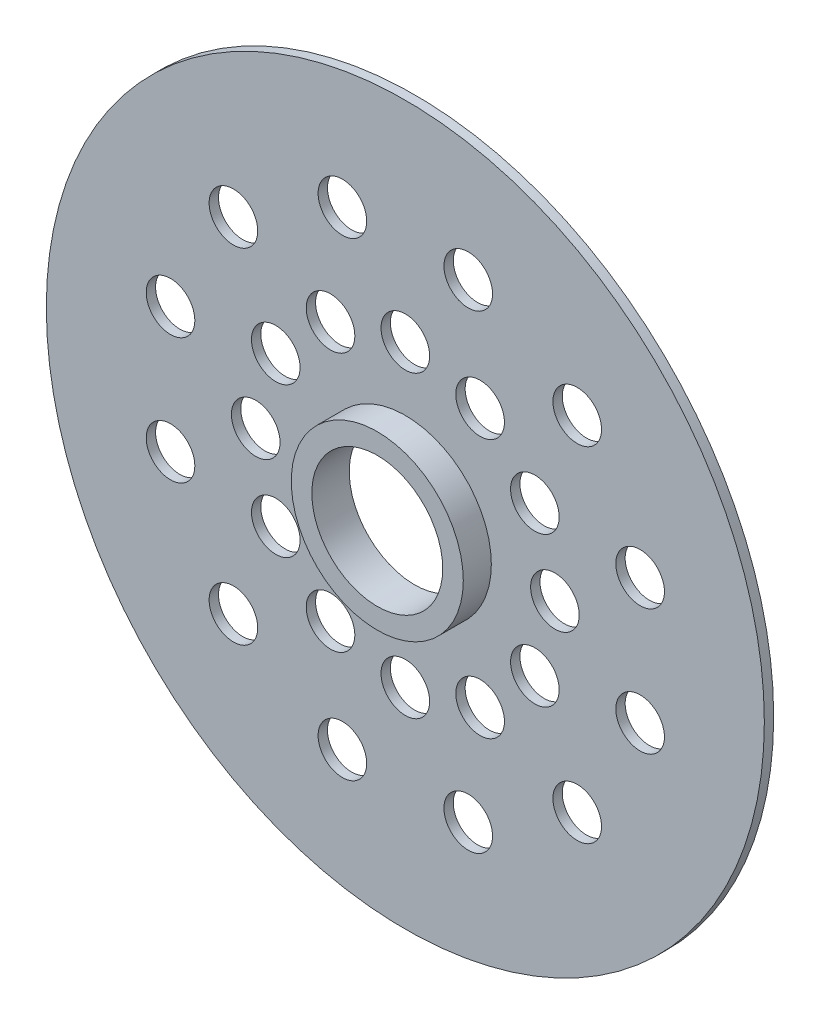
ISO-10303-21;
HEADER;
FILE_DESCRIPTION(('STEP AP214'),'2;1');
FILE_NAME('part.step','',(''),(''),'','','');
FILE_SCHEMA(('AUTOMOTIVE_DESIGN { 1 0 10303 214 1 1 1 1 }'));
ENDSEC;
DATA;
#1=APPLICATION_CONTEXT('core data for automotive mechanical design processes');
#2=APPLICATION_PROTOCOL_DEFINITION('international standard','automotive_design',2000,#1);
#3=PRODUCT_CONTEXT('',#1,'mechanical');
#4=PRODUCT('Part','Part','',(#3));
#5=PRODUCT_RELATED_PRODUCT_CATEGORY('part','',(#4));
#6=PRODUCT_DEFINITION_FORMATION('','',#4);
#7=PRODUCT_DEFINITION_CONTEXT('part definition',#1,'design');
#8=PRODUCT_DEFINITION('design','',#6,#7);
#9=PRODUCT_DEFINITION_SHAPE('','',#8);
#10=(LENGTH_UNIT() NAMED_UNIT(*) SI_UNIT(.MILLI.,.METRE.));
#11=(NAMED_UNIT(*) PLANE_ANGLE_UNIT() SI_UNIT($,.RADIAN.));
#12=(NAMED_UNIT(*) SI_UNIT($,.STERADIAN.) SOLID_ANGLE_UNIT());
#13=UNCERTAINTY_MEASURE_WITH_UNIT(LENGTH_MEASURE(1.E-05),#10,'distance_accuracy_value','');
#14=(GEOMETRIC_REPRESENTATION_CONTEXT(3) GLOBAL_UNCERTAINTY_ASSIGNED_CONTEXT((#13)) GLOBAL_UNIT_ASSIGNED_CONTEXT((#10,
#11,#12)) REPRESENTATION_CONTEXT('',''));
#15=CARTESIAN_POINT('',(0.,0.,0.));
#16=DIRECTION('',(0.,0.,1.));
#17=DIRECTION('',(1.,0.,0.));
#18=AXIS2_PLACEMENT_3D('',#15,#16,#17);
#19=CARTESIAN_POINT('',(0.,0.,-44.5));
#20=DIRECTION('',(0.,0.,1.));
#21=DIRECTION('',(1.,0.,0.));
#22=AXIS2_PLACEMENT_3D('',#19,#20,#21);
#23=PLANE('',#22);
#24=CARTESIAN_POINT('',(-45.9619407771256,45.9619407771256,-44.5));
#25=DIRECTION('',(0.,0.,1.));
#26=DIRECTION('',(1.,0.,0.));
#27=AXIS2_PLACEMENT_3D('',#24,#25,#26);
#28=CIRCLE('',#27,6.5);
#29=CARTESIAN_POINT('',(-39.4619407771256,45.9619407771256,-44.5));
#30=VERTEX_POINT('',#29);
#31=EDGE_CURVE('E184',#30,#30,#28,.T.);
#32=ORIENTED_EDGE('',*,*,#31,.F.);
#33=EDGE_LOOP('',(#32));
#34=FACE_BOUND('',#33,.T.);
#35=CARTESIAN_POINT('',(-16.8232379316639,62.7851787087894,-44.5));
#36=DIRECTION('',(0.,0.,1.));
#37=DIRECTION('',(1.,0.,0.));
#38=AXIS2_PLACEMENT_3D('',#35,#36,#37);
#39=CIRCLE('',#38,6.5);
#40=CARTESIAN_POINT('',(-10.3232379316639,62.7851787087894,-44.5));
#41=VERTEX_POINT('',#40);
#42=EDGE_CURVE('E168',#41,#41,#39,.T.);
#43=ORIENTED_EDGE('',*,*,#42,.F.);
#44=EDGE_LOOP('',(#43));
#45=FACE_BOUND('',#44,.T.);
#46=CARTESIAN_POINT('',(16.8232379316638,62.7851787087894,-44.5));
#47=DIRECTION('',(0.,0.,1.));
#48=DIRECTION('',(1.,0.,0.));
#49=AXIS2_PLACEMENT_3D('',#46,#47,#48);
#50=CIRCLE('',#49,6.5);
#51=CARTESIAN_POINT('',(23.3232379316638,62.7851787087894,-44.5));
#52=VERTEX_POINT('',#51);
#53=EDGE_CURVE('E164',#52,#52,#50,.T.);
#54=ORIENTED_EDGE('',*,*,#53,.F.);
#55=EDGE_LOOP('',(#54));
#56=FACE_BOUND('',#55,.T.);
#57=CARTESIAN_POINT('',(45.9619407771256,45.9619407771256,-44.5));
#58=DIRECTION('',(0.,0.,1.));
#59=DIRECTION('',(1.,0.,0.));
#60=AXIS2_PLACEMENT_3D('',#57,#58,#59);
#61=CIRCLE('',#60,6.5);
#62=CARTESIAN_POINT('',(52.4619407771256,45.9619407771256,-44.5));
#63=VERTEX_POINT('',#62);
#64=EDGE_CURVE('E160',#63,#63,#61,.T.);
#65=ORIENTED_EDGE('',*,*,#64,.F.);
#66=EDGE_LOOP('',(#65));
#67=FACE_BOUND('',#66,.T.);
#68=CARTESIAN_POINT('',(62.7851787087894,16.8232379316638,-44.5));
#69=DIRECTION('',(0.,0.,1.));
#70=DIRECTION('',(1.,0.,0.));
#71=AXIS2_PLACEMENT_3D('',#68,#69,#70);
#72=CIRCLE('',#71,6.50000000000001);
#73=CARTESIAN_POINT('',(69.2851787087894,16.8232379316638,-44.5));
#74=VERTEX_POINT('',#73);
#75=EDGE_CURVE('E155',#74,#74,#72,.T.);
#76=ORIENTED_EDGE('',*,*,#75,.F.);
#77=EDGE_LOOP('',(#76));
#78=FACE_BOUND('',#77,.T.);
#79=CARTESIAN_POINT('',(34.6410161513775,-20.,-44.5));
#80=DIRECTION('',(0.,0.,1.));
#81=DIRECTION('',(1.,0.,0.));
#82=AXIS2_PLACEMENT_3D('',#79,#80,#81);
#83=CIRCLE('',#82,6.5);
#84=CARTESIAN_POINT('',(41.1410161513775,-20.,-44.5));
#85=VERTEX_POINT('',#84);
#86=EDGE_CURVE('E150',#85,#85,#83,.T.);
#87=ORIENTED_EDGE('',*,*,#86,.F.);
#88=EDGE_LOOP('',(#87));
#89=FACE_BOUND('',#88,.T.);
#90=CARTESIAN_POINT('',(20.,-34.6410161513775,-44.5));
#91=DIRECTION('',(0.,0.,1.));
#92=DIRECTION('',(1.,0.,0.));
#93=AXIS2_PLACEMENT_3D('',#90,#91,#92);
#94=CIRCLE('',#93,6.5);
#95=CARTESIAN_POINT('',(26.5,-34.6410161513775,-44.5));
#96=VERTEX_POINT('',#95);
#97=EDGE_CURVE('E145',#96,#96,#94,.T.);
#98=ORIENTED_EDGE('',*,*,#97,.F.);
#99=EDGE_LOOP('',(#98));
#100=FACE_BOUND('',#99,.T.);
#101=CARTESIAN_POINT('',(0.,-40.,-44.5));
#102=DIRECTION('',(0.,0.,1.));
#103=DIRECTION('',(1.,0.,0.));
#104=AXIS2_PLACEMENT_3D('',#101,#102,#103);
#105=CIRCLE('',#104,6.5);
#106=CARTESIAN_POINT('',(6.49999999999999,-40.,-44.5));
#107=VERTEX_POINT('',#106);
#108=EDGE_CURVE('E140',#107,#107,#105,.T.);
#109=ORIENTED_EDGE('',*,*,#108,.F.);
#110=EDGE_LOOP('',(#109));
#111=FACE_BOUND('',#110,.T.);
#112=CARTESIAN_POINT('',(34.6410161513775,20.,-44.5));
#113=DIRECTION('',(0.,0.,1.));
#114=DIRECTION('',(1.,0.,0.));
#115=AXIS2_PLACEMENT_3D('',#112,#113,#114);
#116=CIRCLE('',#115,6.5);
#117=CARTESIAN_POINT('',(41.1410161513775,20.,-44.5));
#118=VERTEX_POINT('',#117);
#119=EDGE_CURVE('E135',#118,#118,#116,.T.);
#120=ORIENTED_EDGE('',*,*,#119,.F.);
#121=EDGE_LOOP('',(#120));
#122=FACE_BOUND('',#121,.T.);
#123=CARTESIAN_POINT('',(20.,34.6410161513775,-44.5));
#124=DIRECTION('',(0.,0.,1.));
#125=DIRECTION('',(1.,0.,0.));
#126=AXIS2_PLACEMENT_3D('',#123,#124,#125);
#127=CIRCLE('',#126,6.5);
#128=CARTESIAN_POINT('',(26.5,34.6410161513775,-44.5));
#129=VERTEX_POINT('',#128);
#130=EDGE_CURVE('E130',#129,#129,#127,.T.);
#131=ORIENTED_EDGE('',*,*,#130,.F.);
#132=EDGE_LOOP('',(#131));
#133=FACE_BOUND('',#132,.T.);
#134=CARTESIAN_POINT('',(0.,40.,-44.5));
#135=DIRECTION('',(0.,0.,1.));
#136=DIRECTION('',(1.,0.,0.));
#137=AXIS2_PLACEMENT_3D('',#134,#135,#136);
#138=CIRCLE('',#137,6.5);
#139=CARTESIAN_POINT('',(6.5,40.,-44.5));
#140=VERTEX_POINT('',#139);
#141=EDGE_CURVE('E125',#140,#140,#138,.T.);
#142=ORIENTED_EDGE('',*,*,#141,.F.);
#143=EDGE_LOOP('',(#142));
#144=FACE_BOUND('',#143,.T.);
#145=CARTESIAN_POINT('',(-20.,34.6410161513775,-44.5));
#146=DIRECTION('',(0.,0.,1.));
#147=DIRECTION('',(1.,0.,0.));
#148=AXIS2_PLACEMENT_3D('',#145,#146,#147);
#149=CIRCLE('',#148,6.5);
#150=CARTESIAN_POINT('',(-13.5,34.6410161513775,-44.5));
#151=VERTEX_POINT('',#150);
#152=EDGE_CURVE('E120',#151,#151,#149,.T.);
#153=ORIENTED_EDGE('',*,*,#152,.F.);
#154=EDGE_LOOP('',(#153));
#155=FACE_BOUND('',#154,.T.);
#156=CARTESIAN_POINT('',(-34.6410161513775,20.,-44.5));
#157=DIRECTION('',(0.,0.,1.));
#158=DIRECTION('',(1.,0.,0.));
#159=AXIS2_PLACEMENT_3D('',#156,#157,#158);
#160=CIRCLE('',#159,6.5);
#161=CARTESIAN_POINT('',(-28.1410161513775,20.,-44.5));
#162=VERTEX_POINT('',#161);
#163=EDGE_CURVE('E115',#162,#162,#160,.T.);
#164=ORIENTED_EDGE('',*,*,#163,.F.);
#165=EDGE_LOOP('',(#164));
#166=FACE_BOUND('',#165,.T.);
#167=CARTESIAN_POINT('',(-40.,0.,-44.5));
#168=DIRECTION('',(0.,0.,1.));
#169=DIRECTION('',(1.,0.,0.));
#170=AXIS2_PLACEMENT_3D('',#167,#168,#169);
#171=CIRCLE('',#170,6.5);
#172=CARTESIAN_POINT('',(-33.5,0.,-44.5));
#173=VERTEX_POINT('',#172);
#174=EDGE_CURVE('E110',#173,#173,#171,.T.);
#175=ORIENTED_EDGE('',*,*,#174,.F.);
#176=EDGE_LOOP('',(#175));
#177=FACE_BOUND('',#176,.T.);
#178=CARTESIAN_POINT('',(-34.6410161513775,-20.,-44.5));
#179=DIRECTION('',(0.,0.,1.));
#180=DIRECTION('',(1.,0.,0.));
#181=AXIS2_PLACEMENT_3D('',#178,#179,#180);
#182=CIRCLE('',#181,6.5);
#183=CARTESIAN_POINT('',(-28.1410161513775,-20.,-44.5));
#184=VERTEX_POINT('',#183);
#185=EDGE_CURVE('E105',#184,#184,#182,.T.);
#186=ORIENTED_EDGE('',*,*,#185,.F.);
#187=EDGE_LOOP('',(#186));
#188=FACE_BOUND('',#187,.T.);
#189=CARTESIAN_POINT('',(-20.,-34.6410161513775,-44.5));
#190=DIRECTION('',(0.,0.,1.));
#191=DIRECTION('',(1.,0.,0.));
#192=AXIS2_PLACEMENT_3D('',#189,#190,#191);
#193=CIRCLE('',#192,6.5);
#194=CARTESIAN_POINT('',(-13.5,-34.6410161513775,-44.5));
#195=VERTEX_POINT('',#194);
#196=EDGE_CURVE('E101',#195,#195,#193,.T.);
#197=ORIENTED_EDGE('',*,*,#196,.F.);
#198=EDGE_LOOP('',(#197));
#199=FACE_BOUND('',#198,.T.);
#200=CARTESIAN_POINT('',(-62.7851787087894,16.8232379316639,-44.5));
#201=DIRECTION('',(0.,0.,1.));
#202=DIRECTION('',(1.,0.,0.));
#203=AXIS2_PLACEMENT_3D('',#200,#201,#202);
#204=CIRCLE('',#203,6.5);
#205=CARTESIAN_POINT('',(-56.2851787087894,16.8232379316639,-44.5));
#206=VERTEX_POINT('',#205);
#207=EDGE_CURVE('E96',#206,#206,#204,.T.);
#208=ORIENTED_EDGE('',*,*,#207,.F.);
#209=EDGE_LOOP('',(#208));
#210=FACE_BOUND('',#209,.T.);
#211=CARTESIAN_POINT('',(-62.7851787087894,-16.8232379316638,-44.5));
#212=DIRECTION('',(0.,0.,1.));
#213=DIRECTION('',(1.,0.,0.));
#214=AXIS2_PLACEMENT_3D('',#211,#212,#213);
#215=CIRCLE('',#214,6.5);
#216=CARTESIAN_POINT('',(-56.2851787087894,-16.8232379316638,-44.5));
#217=VERTEX_POINT('',#216);
#218=EDGE_CURVE('E91',#217,#217,#215,.T.);
#219=ORIENTED_EDGE('',*,*,#218,.F.);
#220=EDGE_LOOP('',(#219));
#221=FACE_BOUND('',#220,.T.);
#222=CARTESIAN_POINT('',(-45.9619407771256,-45.9619407771256,-44.5));
#223=DIRECTION('',(0.,0.,1.));
#224=DIRECTION('',(1.,0.,0.));
#225=AXIS2_PLACEMENT_3D('',#222,#223,#224);
#226=CIRCLE('',#225,6.5);
#227=CARTESIAN_POINT('',(-39.4619407771256,-45.9619407771256,-44.5));
#228=VERTEX_POINT('',#227);
#229=EDGE_CURVE('E86',#228,#228,#226,.T.);
#230=ORIENTED_EDGE('',*,*,#229,.F.);
#231=EDGE_LOOP('',(#230));
#232=FACE_BOUND('',#231,.T.);
#233=CARTESIAN_POINT('',(-16.8232379316638,-62.7851787087894,-44.5));
#234=DIRECTION('',(0.,0.,1.));
#235=DIRECTION('',(1.,0.,0.));
#236=AXIS2_PLACEMENT_3D('',#233,#234,#235);
#237=CIRCLE('',#236,6.5);
#238=CARTESIAN_POINT('',(-10.3232379316638,-62.7851787087894,-44.5));
#239=VERTEX_POINT('',#238);
#240=EDGE_CURVE('E81',#239,#239,#237,.T.);
#241=ORIENTED_EDGE('',*,*,#240,.F.);
#242=EDGE_LOOP('',(#241));
#243=FACE_BOUND('',#242,.T.);
#244=CARTESIAN_POINT('',(16.8232379316639,-62.7851787087894,-44.5));
#245=DIRECTION('',(0.,0.,1.));
#246=DIRECTION('',(1.,0.,0.));
#247=AXIS2_PLACEMENT_3D('',#244,#245,#246);
#248=CIRCLE('',#247,6.5);
#249=CARTESIAN_POINT('',(23.3232379316639,-62.7851787087894,-44.5));
#250=VERTEX_POINT('',#249);
#251=EDGE_CURVE('E76',#250,#250,#248,.T.);
#252=ORIENTED_EDGE('',*,*,#251,.F.);
#253=EDGE_LOOP('',(#252));
#254=FACE_BOUND('',#253,.T.);
#255=CARTESIAN_POINT('',(45.9619407771256,-45.9619407771256,-44.5));
#256=DIRECTION('',(0.,0.,1.));
#257=DIRECTION('',(1.,0.,0.));
#258=AXIS2_PLACEMENT_3D('',#255,#256,#257);
#259=CIRCLE('',#258,6.5);
#260=CARTESIAN_POINT('',(52.4619407771256,-45.9619407771256,-44.5));
#261=VERTEX_POINT('',#260);
#262=EDGE_CURVE('E72',#261,#261,#259,.T.);
#263=ORIENTED_EDGE('',*,*,#262,.F.);
#264=EDGE_LOOP('',(#263));
#265=FACE_BOUND('',#264,.T.);
#266=CARTESIAN_POINT('',(62.7851787087894,-16.8232379316638,-44.5));
#267=DIRECTION('',(0.,0.,1.));
#268=DIRECTION('',(1.,0.,0.));
#269=AXIS2_PLACEMENT_3D('',#266,#267,#268);
#270=CIRCLE('',#269,6.50000000000001);
#271=CARTESIAN_POINT('',(69.2851787087894,-16.8232379316638,-44.5));
#272=VERTEX_POINT('',#271);
#273=EDGE_CURVE('E67',#272,#272,#270,.T.);
#274=ORIENTED_EDGE('',*,*,#273,.F.);
#275=EDGE_LOOP('',(#274));
#276=FACE_BOUND('',#275,.T.);
#277=CARTESIAN_POINT('',(40.,0.,-44.5));
#278=DIRECTION('',(0.,0.,1.));
#279=DIRECTION('',(1.,0.,0.));
#280=AXIS2_PLACEMENT_3D('',#277,#278,#279);
#281=CIRCLE('',#280,6.5);
#282=CARTESIAN_POINT('',(46.5,0.,-44.5));
#283=VERTEX_POINT('',#282);
#284=EDGE_CURVE('E62',#283,#283,#281,.T.);
#285=ORIENTED_EDGE('',*,*,#284,.F.);
#286=EDGE_LOOP('',(#285));
#287=FACE_BOUND('',#286,.T.);
#288=CARTESIAN_POINT('',(0.,0.,-44.5));
#289=DIRECTION('',(0.,0.,1.));
#290=DIRECTION('',(1.,0.,0.));
#291=AXIS2_PLACEMENT_3D('',#288,#289,#290);
#292=CIRCLE('',#291,96.);
#293=CARTESIAN_POINT('',(96.,0.,-44.5));
#294=VERTEX_POINT('',#293);
#295=EDGE_CURVE('E10',#294,#294,#292,.T.);
#296=ORIENTED_EDGE('',*,*,#295,.T.);
#297=EDGE_LOOP('',(#296));
#298=FACE_BOUND('',#297,.T.);
#299=CARTESIAN_POINT('',(0.,0.,-44.5));
#300=DIRECTION('',(0.,0.,1.));
#301=DIRECTION('',(1.,0.,0.));
#302=AXIS2_PLACEMENT_3D('',#299,#300,#301);
#303=CIRCLE('',#302,23.);
#304=CARTESIAN_POINT('',(23.,0.,-44.5));
#305=VERTEX_POINT('',#304);
#306=EDGE_CURVE('E195',#305,#305,#303,.F.);
#307=ORIENTED_EDGE('',*,*,#306,.T.);
#308=EDGE_LOOP('',(#307));
#309=FACE_BOUND('',#308,.T.);
#310=ADVANCED_FACE('F36',(#34,#45,#56,#67,#78,#89,#100,#111,#122,#133,#144,#155,#166,#177,#188,
#199,#210,#221,#232,#243,#254,#265,#276,#287,#298,#309),#23,.T.);
#311=CARTESIAN_POINT('',(0.,0.,-47.));
#312=DIRECTION('',(0.,0.,1.));
#313=DIRECTION('',(1.,0.,0.));
#314=AXIS2_PLACEMENT_3D('',#311,#312,#313);
#315=PLANE('',#314);
#316=CARTESIAN_POINT('',(-45.9619407771256,45.9619407771256,-47.));
#317=DIRECTION('',(0.,0.,1.));
#318=DIRECTION('',(1.,0.,0.));
#319=AXIS2_PLACEMENT_3D('',#316,#317,#318);
#320=CIRCLE('',#319,6.5);
#321=CARTESIAN_POINT('',(-39.4619407771256,45.9619407771256,-47.));
#322=VERTEX_POINT('',#321);
#323=EDGE_CURVE('E40',#322,#322,#320,.T.);
#324=ORIENTED_EDGE('',*,*,#323,.T.);
#325=EDGE_LOOP('',(#324));
#326=FACE_BOUND('',#325,.T.);
#327=CARTESIAN_POINT('',(-16.8232379316639,62.7851787087894,-47.));
#328=DIRECTION('',(0.,0.,1.));
#329=DIRECTION('',(1.,0.,0.));
#330=AXIS2_PLACEMENT_3D('',#327,#328,#329);
#331=CIRCLE('',#330,6.5);
#332=CARTESIAN_POINT('',(-10.3232379316639,62.7851787087894,-47.));
#333=VERTEX_POINT('',#332);
#334=EDGE_CURVE('E165',#333,#333,#331,.T.);
#335=ORIENTED_EDGE('',*,*,#334,.T.);
#336=EDGE_LOOP('',(#335));
#337=FACE_BOUND('',#336,.T.);
#338=CARTESIAN_POINT('',(16.8232379316638,62.7851787087894,-47.));
#339=DIRECTION('',(0.,0.,1.));
#340=DIRECTION('',(1.,0.,0.));
#341=AXIS2_PLACEMENT_3D('',#338,#339,#340);
#342=CIRCLE('',#341,6.5);
#343=CARTESIAN_POINT('',(23.3232379316638,62.7851787087894,-47.));
#344=VERTEX_POINT('',#343);
#345=EDGE_CURVE('E161',#344,#344,#342,.T.);
#346=ORIENTED_EDGE('',*,*,#345,.T.);
#347=EDGE_LOOP('',(#346));
#348=FACE_BOUND('',#347,.T.);
#349=CARTESIAN_POINT('',(45.9619407771256,45.9619407771256,-47.));
#350=DIRECTION('',(0.,0.,1.));
#351=DIRECTION('',(1.,0.,0.));
#352=AXIS2_PLACEMENT_3D('',#349,#350,#351);
#353=CIRCLE('',#352,6.5);
#354=CARTESIAN_POINT('',(52.4619407771256,45.9619407771256,-47.));
#355=VERTEX_POINT('',#354);
#356=EDGE_CURVE('E156',#355,#355,#353,.T.);
#357=ORIENTED_EDGE('',*,*,#356,.T.);
#358=EDGE_LOOP('',(#357));
#359=FACE_BOUND('',#358,.T.);
#360=CARTESIAN_POINT('',(62.7851787087894,16.8232379316638,-47.));
#361=DIRECTION('',(0.,0.,1.));
#362=DIRECTION('',(1.,0.,0.));
#363=AXIS2_PLACEMENT_3D('',#360,#361,#362);
#364=CIRCLE('',#363,6.50000000000001);
#365=CARTESIAN_POINT('',(69.2851787087894,16.8232379316638,-47.));
#366=VERTEX_POINT('',#365);
#367=EDGE_CURVE('E151',#366,#366,#364,.T.);
#368=ORIENTED_EDGE('',*,*,#367,.T.);
#369=EDGE_LOOP('',(#368));
#370=FACE_BOUND('',#369,.T.);
#371=CARTESIAN_POINT('',(34.6410161513775,-20.,-47.));
#372=DIRECTION('',(0.,0.,1.));
#373=DIRECTION('',(1.,0.,0.));
#374=AXIS2_PLACEMENT_3D('',#371,#372,#373);
#375=CIRCLE('',#374,6.5);
#376=CARTESIAN_POINT('',(41.1410161513775,-20.,-47.));
#377=VERTEX_POINT('',#376);
#378=EDGE_CURVE('E146',#377,#377,#375,.T.);
#379=ORIENTED_EDGE('',*,*,#378,.T.);
#380=EDGE_LOOP('',(#379));
#381=FACE_BOUND('',#380,.T.);
#382=CARTESIAN_POINT('',(20.,-34.6410161513775,-47.));
#383=DIRECTION('',(0.,0.,1.));
#384=DIRECTION('',(1.,0.,0.));
#385=AXIS2_PLACEMENT_3D('',#382,#383,#384);
#386=CIRCLE('',#385,6.5);
#387=CARTESIAN_POINT('',(26.5,-34.6410161513775,-47.));
#388=VERTEX_POINT('',#387);
#389=EDGE_CURVE('E141',#388,#388,#386,.T.);
#390=ORIENTED_EDGE('',*,*,#389,.T.);
#391=EDGE_LOOP('',(#390));
#392=FACE_BOUND('',#391,.T.);
#393=CARTESIAN_POINT('',(0.,-40.,-47.));
#394=DIRECTION('',(0.,0.,1.));
#395=DIRECTION('',(1.,0.,0.));
#396=AXIS2_PLACEMENT_3D('',#393,#394,#395);
#397=CIRCLE('',#396,6.5);
#398=CARTESIAN_POINT('',(6.49999999999999,-40.,-47.));
#399=VERTEX_POINT('',#398);
#400=EDGE_CURVE('E136',#399,#399,#397,.T.);
#401=ORIENTED_EDGE('',*,*,#400,.T.);
#402=EDGE_LOOP('',(#401));
#403=FACE_BOUND('',#402,.T.);
#404=CARTESIAN_POINT('',(34.6410161513775,20.,-47.));
#405=DIRECTION('',(0.,0.,1.));
#406=DIRECTION('',(1.,0.,0.));
#407=AXIS2_PLACEMENT_3D('',#404,#405,#406);
#408=CIRCLE('',#407,6.5);
#409=CARTESIAN_POINT('',(41.1410161513775,20.,-47.));
#410=VERTEX_POINT('',#409);
#411=EDGE_CURVE('E131',#410,#410,#408,.T.);
#412=ORIENTED_EDGE('',*,*,#411,.T.);
#413=EDGE_LOOP('',(#412));
#414=FACE_BOUND('',#413,.T.);
#415=CARTESIAN_POINT('',(20.,34.6410161513775,-47.));
#416=DIRECTION('',(0.,0.,1.));
#417=DIRECTION('',(1.,0.,0.));
#418=AXIS2_PLACEMENT_3D('',#415,#416,#417);
#419=CIRCLE('',#418,6.5);
#420=CARTESIAN_POINT('',(26.5,34.6410161513775,-47.));
#421=VERTEX_POINT('',#420);
#422=EDGE_CURVE('E126',#421,#421,#419,.T.);
#423=ORIENTED_EDGE('',*,*,#422,.T.);
#424=EDGE_LOOP('',(#423));
#425=FACE_BOUND('',#424,.T.);
#426=CARTESIAN_POINT('',(0.,40.,-47.));
#427=DIRECTION('',(0.,0.,1.));
#428=DIRECTION('',(1.,0.,0.));
#429=AXIS2_PLACEMENT_3D('',#426,#427,#428);
#430=CIRCLE('',#429,6.5);
#431=CARTESIAN_POINT('',(6.5,40.,-47.));
#432=VERTEX_POINT('',#431);
#433=EDGE_CURVE('E121',#432,#432,#430,.T.);
#434=ORIENTED_EDGE('',*,*,#433,.T.);
#435=EDGE_LOOP('',(#434));
#436=FACE_BOUND('',#435,.T.);
#437=CARTESIAN_POINT('',(-20.,34.6410161513775,-47.));
#438=DIRECTION('',(0.,0.,1.));
#439=DIRECTION('',(1.,0.,0.));
#440=AXIS2_PLACEMENT_3D('',#437,#438,#439);
#441=CIRCLE('',#440,6.5);
#442=CARTESIAN_POINT('',(-13.5,34.6410161513775,-47.));
#443=VERTEX_POINT('',#442);
#444=EDGE_CURVE('E116',#443,#443,#441,.T.);
#445=ORIENTED_EDGE('',*,*,#444,.T.);
#446=EDGE_LOOP('',(#445));
#447=FACE_BOUND('',#446,.T.);
#448=CARTESIAN_POINT('',(-34.6410161513775,20.,-47.));
#449=DIRECTION('',(0.,0.,1.));
#450=DIRECTION('',(1.,0.,0.));
#451=AXIS2_PLACEMENT_3D('',#448,#449,#450);
#452=CIRCLE('',#451,6.5);
#453=CARTESIAN_POINT('',(-28.1410161513775,20.,-47.));
#454=VERTEX_POINT('',#453);
#455=EDGE_CURVE('E111',#454,#454,#452,.T.);
#456=ORIENTED_EDGE('',*,*,#455,.T.);
#457=EDGE_LOOP('',(#456));
#458=FACE_BOUND('',#457,.T.);
#459=CARTESIAN_POINT('',(-40.,0.,-47.));
#460=DIRECTION('',(0.,0.,1.));
#461=DIRECTION('',(1.,0.,0.));
#462=AXIS2_PLACEMENT_3D('',#459,#460,#461);
#463=CIRCLE('',#462,6.5);
#464=CARTESIAN_POINT('',(-33.5,0.,-47.));
#465=VERTEX_POINT('',#464);
#466=EDGE_CURVE('E106',#465,#465,#463,.T.);
#467=ORIENTED_EDGE('',*,*,#466,.T.);
#468=EDGE_LOOP('',(#467));
#469=FACE_BOUND('',#468,.T.);
#470=CARTESIAN_POINT('',(-34.6410161513775,-20.,-47.));
#471=DIRECTION('',(0.,0.,1.));
#472=DIRECTION('',(1.,0.,0.));
#473=AXIS2_PLACEMENT_3D('',#470,#471,#472);
#474=CIRCLE('',#473,6.5);
#475=CARTESIAN_POINT('',(-28.1410161513775,-20.,-47.));
#476=VERTEX_POINT('',#475);
#477=EDGE_CURVE('E102',#476,#476,#474,.T.);
#478=ORIENTED_EDGE('',*,*,#477,.T.);
#479=EDGE_LOOP('',(#478));
#480=FACE_BOUND('',#479,.T.);
#481=CARTESIAN_POINT('',(-20.,-34.6410161513775,-47.));
#482=DIRECTION('',(0.,0.,1.));
#483=DIRECTION('',(1.,0.,0.));
#484=AXIS2_PLACEMENT_3D('',#481,#482,#483);
#485=CIRCLE('',#484,6.5);
#486=CARTESIAN_POINT('',(-13.5,-34.6410161513775,-47.));
#487=VERTEX_POINT('',#486);
#488=EDGE_CURVE('E97',#487,#487,#485,.T.);
#489=ORIENTED_EDGE('',*,*,#488,.T.);
#490=EDGE_LOOP('',(#489));
#491=FACE_BOUND('',#490,.T.);
#492=CARTESIAN_POINT('',(-62.7851787087894,16.8232379316639,-47.));
#493=DIRECTION('',(0.,0.,1.));
#494=DIRECTION('',(1.,0.,0.));
#495=AXIS2_PLACEMENT_3D('',#492,#493,#494);
#496=CIRCLE('',#495,6.5);
#497=CARTESIAN_POINT('',(-56.2851787087894,16.8232379316639,-47.));
#498=VERTEX_POINT('',#497);
#499=EDGE_CURVE('E92',#498,#498,#496,.T.);
#500=ORIENTED_EDGE('',*,*,#499,.T.);
#501=EDGE_LOOP('',(#500));
#502=FACE_BOUND('',#501,.T.);
#503=CARTESIAN_POINT('',(-62.7851787087894,-16.8232379316638,-47.));
#504=DIRECTION('',(0.,0.,1.));
#505=DIRECTION('',(1.,0.,0.));
#506=AXIS2_PLACEMENT_3D('',#503,#504,#505);
#507=CIRCLE('',#506,6.5);
#508=CARTESIAN_POINT('',(-56.2851787087894,-16.8232379316638,-47.));
#509=VERTEX_POINT('',#508);
#510=EDGE_CURVE('E87',#509,#509,#507,.T.);
#511=ORIENTED_EDGE('',*,*,#510,.T.);
#512=EDGE_LOOP('',(#511));
#513=FACE_BOUND('',#512,.T.);
#514=CARTESIAN_POINT('',(-45.9619407771256,-45.9619407771256,-47.));
#515=DIRECTION('',(0.,0.,1.));
#516=DIRECTION('',(1.,0.,0.));
#517=AXIS2_PLACEMENT_3D('',#514,#515,#516);
#518=CIRCLE('',#517,6.5);
#519=CARTESIAN_POINT('',(-39.4619407771256,-45.9619407771256,-47.));
#520=VERTEX_POINT('',#519);
#521=EDGE_CURVE('E82',#520,#520,#518,.T.);
#522=ORIENTED_EDGE('',*,*,#521,.T.);
#523=EDGE_LOOP('',(#522));
#524=FACE_BOUND('',#523,.T.);
#525=CARTESIAN_POINT('',(-16.8232379316638,-62.7851787087894,-47.));
#526=DIRECTION('',(0.,0.,1.));
#527=DIRECTION('',(1.,0.,0.));
#528=AXIS2_PLACEMENT_3D('',#525,#526,#527);
#529=CIRCLE('',#528,6.5);
#530=CARTESIAN_POINT('',(-10.3232379316638,-62.7851787087894,-47.));
#531=VERTEX_POINT('',#530);
#532=EDGE_CURVE('E77',#531,#531,#529,.T.);
#533=ORIENTED_EDGE('',*,*,#532,.T.);
#534=EDGE_LOOP('',(#533));
#535=FACE_BOUND('',#534,.T.);
#536=CARTESIAN_POINT('',(16.8232379316639,-62.7851787087894,-47.));
#537=DIRECTION('',(0.,0.,1.));
#538=DIRECTION('',(1.,0.,0.));
#539=AXIS2_PLACEMENT_3D('',#536,#537,#538);
#540=CIRCLE('',#539,6.5);
#541=CARTESIAN_POINT('',(23.3232379316639,-62.7851787087894,-47.));
#542=VERTEX_POINT('',#541);
#543=EDGE_CURVE('E73',#542,#542,#540,.T.);
#544=ORIENTED_EDGE('',*,*,#543,.T.);
#545=EDGE_LOOP('',(#544));
#546=FACE_BOUND('',#545,.T.);
#547=CARTESIAN_POINT('',(45.9619407771256,-45.9619407771256,-47.));
#548=DIRECTION('',(0.,0.,1.));
#549=DIRECTION('',(1.,0.,0.));
#550=AXIS2_PLACEMENT_3D('',#547,#548,#549);
#551=CIRCLE('',#550,6.5);
#552=CARTESIAN_POINT('',(52.4619407771256,-45.9619407771256,-47.));
#553=VERTEX_POINT('',#552);
#554=EDGE_CURVE('E68',#553,#553,#551,.T.);
#555=ORIENTED_EDGE('',*,*,#554,.T.);
#556=EDGE_LOOP('',(#555));
#557=FACE_BOUND('',#556,.T.);
#558=CARTESIAN_POINT('',(62.7851787087894,-16.8232379316638,-47.));
#559=DIRECTION('',(0.,0.,1.));
#560=DIRECTION('',(1.,0.,0.));
#561=AXIS2_PLACEMENT_3D('',#558,#559,#560);
#562=CIRCLE('',#561,6.50000000000001);
#563=CARTESIAN_POINT('',(69.2851787087894,-16.8232379316638,-47.));
#564=VERTEX_POINT('',#563);
#565=EDGE_CURVE('E63',#564,#564,#562,.T.);
#566=ORIENTED_EDGE('',*,*,#565,.T.);
#567=EDGE_LOOP('',(#566));
#568=FACE_BOUND('',#567,.T.);
#569=CARTESIAN_POINT('',(40.,0.,-47.));
#570=DIRECTION('',(0.,0.,1.));
#571=DIRECTION('',(1.,0.,0.));
#572=AXIS2_PLACEMENT_3D('',#569,#570,#571);
#573=CIRCLE('',#572,6.5);
#574=CARTESIAN_POINT('',(46.5,0.,-47.));
#575=VERTEX_POINT('',#574);
#576=EDGE_CURVE('E58',#575,#575,#573,.T.);
#577=ORIENTED_EDGE('',*,*,#576,.T.);
#578=EDGE_LOOP('',(#577));
#579=FACE_BOUND('',#578,.T.);
#580=CARTESIAN_POINT('',(0.,0.,-47.));
#581=DIRECTION('',(0.,0.,1.));
#582=DIRECTION('',(1.,0.,0.));
#583=AXIS2_PLACEMENT_3D('',#580,#581,#582);
#584=CIRCLE('',#583,17.5);
#585=CARTESIAN_POINT('',(17.5,0.,-47.));
#586=VERTEX_POINT('',#585);
#587=EDGE_CURVE('E53',#586,#586,#584,.T.);
#588=ORIENTED_EDGE('',*,*,#587,.T.);
#589=EDGE_LOOP('',(#588));
#590=FACE_BOUND('',#589,.T.);
#591=CARTESIAN_POINT('',(0.,0.,-47.));
#592=DIRECTION('',(0.,0.,1.));
#593=DIRECTION('',(1.,0.,0.));
#594=AXIS2_PLACEMENT_3D('',#591,#592,#593);
#595=CIRCLE('',#594,96.);
#596=CARTESIAN_POINT('',(96.,0.,-47.));
#597=VERTEX_POINT('',#596);
#598=EDGE_CURVE('E45',#597,#597,#595,.T.);
#599=ORIENTED_EDGE('',*,*,#598,.F.);
#600=EDGE_LOOP('',(#599));
#601=FACE_BOUND('',#600,.T.);
#602=ADVANCED_FACE('F206',(#326,#337,#348,#359,#370,#381,#392,#403,#414,#425,#436,#447,#458,
#469,#480,#491,#502,#513,#524,#535,#546,#557,#568,#579,#590,#601),#315,.F.);
#603=CARTESIAN_POINT('',(0.,0.,-44.5));
#604=DIRECTION('',(0.,0.,-1.));
#605=DIRECTION('',(-1.,0.,0.));
#606=AXIS2_PLACEMENT_3D('',#603,#604,#605);
#607=CYLINDRICAL_SURFACE('',#606,96.);
#608=ORIENTED_EDGE('',*,*,#295,.F.);
#609=EDGE_LOOP('',(#608));
#610=FACE_BOUND('',#609,.T.);
#611=ORIENTED_EDGE('',*,*,#598,.T.);
#612=EDGE_LOOP('',(#611));
#613=FACE_BOUND('',#612,.T.);
#614=ADVANCED_FACE('F38',(#610,#613),#607,.T.);
#615=CARTESIAN_POINT('',(0.,0.,-44.5));
#616=DIRECTION('',(0.,0.,-1.));
#617=DIRECTION('',(-1.,0.,0.));
#618=AXIS2_PLACEMENT_3D('',#615,#616,#617);
#619=CYLINDRICAL_SURFACE('',#618,17.5);
#620=ORIENTED_EDGE('',*,*,#587,.F.);
#621=EDGE_LOOP('',(#620));
#622=FACE_BOUND('',#621,.T.);
#623=CARTESIAN_POINT('',(0.,0.,-37.));
#624=DIRECTION('',(0.,0.,1.));
#625=DIRECTION('',(1.,0.,0.));
#626=AXIS2_PLACEMENT_3D('',#623,#624,#625);
#627=CIRCLE('',#626,17.5);
#628=CARTESIAN_POINT('',(17.5,0.,-37.));
#629=VERTEX_POINT('',#628);
#630=EDGE_CURVE('E188',#629,#629,#627,.T.);
#631=ORIENTED_EDGE('',*,*,#630,.T.);
#632=EDGE_LOOP('',(#631));
#633=FACE_BOUND('',#632,.T.);
#634=ADVANCED_FACE('F209',(#622,#633),#619,.F.);
#635=CARTESIAN_POINT('',(0.,0.,-37.));
#636=DIRECTION('',(0.,0.,1.));
#637=DIRECTION('',(1.,0.,0.));
#638=AXIS2_PLACEMENT_3D('',#635,#636,#637);
#639=PLANE('',#638);
#640=CARTESIAN_POINT('',(0.,0.,-37.));
#641=DIRECTION('',(0.,0.,1.));
#642=DIRECTION('',(1.,0.,0.));
#643=AXIS2_PLACEMENT_3D('',#640,#641,#642);
#644=CIRCLE('',#643,23.);
#645=CARTESIAN_POINT('',(23.,0.,-37.));
#646=VERTEX_POINT('',#645);
#647=EDGE_CURVE('E192',#646,#646,#644,.T.);
#648=ORIENTED_EDGE('',*,*,#647,.T.);
#649=EDGE_LOOP('',(#648));
#650=FACE_BOUND('',#649,.T.);
#651=ORIENTED_EDGE('',*,*,#630,.F.);
#652=EDGE_LOOP('',(#651));
#653=FACE_BOUND('',#652,.T.);
#654=ADVANCED_FACE('F212',(#650,#653),#639,.T.);
#655=CARTESIAN_POINT('',(0.,0.,-37.));
#656=DIRECTION('',(0.,0.,-1.));
#657=DIRECTION('',(-1.,0.,0.));
#658=AXIS2_PLACEMENT_3D('',#655,#656,#657);
#659=CYLINDRICAL_SURFACE('',#658,23.);
#660=ORIENTED_EDGE('',*,*,#306,.F.);
#661=EDGE_LOOP('',(#660));
#662=FACE_BOUND('',#661,.T.);
#663=ORIENTED_EDGE('',*,*,#647,.F.);
#664=EDGE_LOOP('',(#663));
#665=FACE_BOUND('',#664,.T.);
#666=ADVANCED_FACE('F217',(#662,#665),#659,.T.);
#667=CARTESIAN_POINT('',(40.,0.,-100.));
#668=DIRECTION('',(0.,0.,1.));
#669=DIRECTION('',(1.,0.,0.));
#670=AXIS2_PLACEMENT_3D('',#667,#668,#669);
#671=CYLINDRICAL_SURFACE('',#670,6.5);
#672=ORIENTED_EDGE('',*,*,#284,.T.);
#673=EDGE_LOOP('',(#672));
#674=FACE_BOUND('',#673,.T.);
#675=ORIENTED_EDGE('',*,*,#576,.F.);
#676=EDGE_LOOP('',(#675));
#677=FACE_BOUND('',#676,.T.);
#678=ADVANCED_FACE('F223',(#674,#677),#671,.F.);
#679=CARTESIAN_POINT('',(62.7851787087894,-16.8232379316638,-100.));
#680=DIRECTION('',(0.,0.,1.));
#681=DIRECTION('',(1.,0.,0.));
#682=AXIS2_PLACEMENT_3D('',#679,#680,#681);
#683=CYLINDRICAL_SURFACE('',#682,6.50000000000001);
#684=ORIENTED_EDGE('',*,*,#273,.T.);
#685=EDGE_LOOP('',(#684));
#686=FACE_BOUND('',#685,.T.);
#687=ORIENTED_EDGE('',*,*,#565,.F.);
#688=EDGE_LOOP('',(#687));
#689=FACE_BOUND('',#688,.T.);
#690=ADVANCED_FACE('F387',(#686,#689),#683,.F.);
#691=CARTESIAN_POINT('',(45.9619407771256,-45.9619407771256,-100.));
#692=DIRECTION('',(0.,0.,1.));
#693=DIRECTION('',(1.,0.,0.));
#694=AXIS2_PLACEMENT_3D('',#691,#692,#693);
#695=CYLINDRICAL_SURFACE('',#694,6.5);
#696=ORIENTED_EDGE('',*,*,#262,.T.);
#697=EDGE_LOOP('',(#696));
#698=FACE_BOUND('',#697,.T.);
#699=ORIENTED_EDGE('',*,*,#554,.F.);
#700=EDGE_LOOP('',(#699));
#701=FACE_BOUND('',#700,.T.);
#702=ADVANCED_FACE('F391',(#698,#701),#695,.F.);
#703=CARTESIAN_POINT('',(16.8232379316639,-62.7851787087894,-100.));
#704=DIRECTION('',(0.,0.,1.));
#705=DIRECTION('',(1.,0.,0.));
#706=AXIS2_PLACEMENT_3D('',#703,#704,#705);
#707=CYLINDRICAL_SURFACE('',#706,6.5);
#708=ORIENTED_EDGE('',*,*,#251,.T.);
#709=EDGE_LOOP('',(#708));
#710=FACE_BOUND('',#709,.T.);
#711=ORIENTED_EDGE('',*,*,#543,.F.);
#712=EDGE_LOOP('',(#711));
#713=FACE_BOUND('',#712,.T.);
#714=ADVANCED_FACE('F455',(#710,#713),#707,.F.);
#715=CARTESIAN_POINT('',(-16.8232379316638,-62.7851787087894,-100.));
#716=DIRECTION('',(0.,0.,1.));
#717=DIRECTION('',(1.,0.,0.));
#718=AXIS2_PLACEMENT_3D('',#715,#716,#717);
#719=CYLINDRICAL_SURFACE('',#718,6.5);
#720=ORIENTED_EDGE('',*,*,#240,.T.);
#721=EDGE_LOOP('',(#720));
#722=FACE_BOUND('',#721,.T.);
#723=ORIENTED_EDGE('',*,*,#532,.F.);
#724=EDGE_LOOP('',(#723));
#725=FACE_BOUND('',#724,.T.);
#726=ADVANCED_FACE('F459',(#722,#725),#719,.F.);
#727=CARTESIAN_POINT('',(-45.9619407771256,-45.9619407771256,-100.));
#728=DIRECTION('',(0.,0.,1.));
#729=DIRECTION('',(1.,0.,0.));
#730=AXIS2_PLACEMENT_3D('',#727,#728,#729);
#731=CYLINDRICAL_SURFACE('',#730,6.5);
#732=ORIENTED_EDGE('',*,*,#229,.T.);
#733=EDGE_LOOP('',(#732));
#734=FACE_BOUND('',#733,.T.);
#735=ORIENTED_EDGE('',*,*,#521,.F.);
#736=EDGE_LOOP('',(#735));
#737=FACE_BOUND('',#736,.T.);
#738=ADVANCED_FACE('F463',(#734,#737),#731,.F.);
#739=CARTESIAN_POINT('',(-62.7851787087894,-16.8232379316638,-100.));
#740=DIRECTION('',(0.,0.,1.));
#741=DIRECTION('',(1.,0.,0.));
#742=AXIS2_PLACEMENT_3D('',#739,#740,#741);
#743=CYLINDRICAL_SURFACE('',#742,6.5);
#744=ORIENTED_EDGE('',*,*,#218,.T.);
#745=EDGE_LOOP('',(#744));
#746=FACE_BOUND('',#745,.T.);
#747=ORIENTED_EDGE('',*,*,#510,.F.);
#748=EDGE_LOOP('',(#747));
#749=FACE_BOUND('',#748,.T.);
#750=ADVANCED_FACE('F467',(#746,#749),#743,.F.);
#751=CARTESIAN_POINT('',(-62.7851787087894,16.8232379316639,-100.));
#752=DIRECTION('',(0.,0.,1.));
#753=DIRECTION('',(1.,0.,0.));
#754=AXIS2_PLACEMENT_3D('',#751,#752,#753);
#755=CYLINDRICAL_SURFACE('',#754,6.5);
#756=ORIENTED_EDGE('',*,*,#207,.T.);
#757=EDGE_LOOP('',(#756));
#758=FACE_BOUND('',#757,.T.);
#759=ORIENTED_EDGE('',*,*,#499,.F.);
#760=EDGE_LOOP('',(#759));
#761=FACE_BOUND('',#760,.T.);
#762=ADVANCED_FACE('F417',(#758,#761),#755,.F.);
#763=CARTESIAN_POINT('',(-20.,-34.6410161513775,-100.));
#764=DIRECTION('',(0.,0.,1.));
#765=DIRECTION('',(1.,0.,0.));
#766=AXIS2_PLACEMENT_3D('',#763,#764,#765);
#767=CYLINDRICAL_SURFACE('',#766,6.5);
#768=ORIENTED_EDGE('',*,*,#196,.T.);
#769=EDGE_LOOP('',(#768));
#770=FACE_BOUND('',#769,.T.);
#771=ORIENTED_EDGE('',*,*,#488,.F.);
#772=EDGE_LOOP('',(#771));
#773=FACE_BOUND('',#772,.T.);
#774=ADVANCED_FACE('F413',(#770,#773),#767,.F.);
#775=CARTESIAN_POINT('',(-34.6410161513775,-20.,-100.));
#776=DIRECTION('',(0.,0.,1.));
#777=DIRECTION('',(1.,0.,0.));
#778=AXIS2_PLACEMENT_3D('',#775,#776,#777);
#779=CYLINDRICAL_SURFACE('',#778,6.5);
#780=ORIENTED_EDGE('',*,*,#185,.T.);
#781=EDGE_LOOP('',(#780));
#782=FACE_BOUND('',#781,.T.);
#783=ORIENTED_EDGE('',*,*,#477,.F.);
#784=EDGE_LOOP('',(#783));
#785=FACE_BOUND('',#784,.T.);
#786=ADVANCED_FACE('F416',(#782,#785),#779,.F.);
#787=CARTESIAN_POINT('',(-40.,0.,-100.));
#788=DIRECTION('',(0.,0.,1.));
#789=DIRECTION('',(1.,0.,0.));
#790=AXIS2_PLACEMENT_3D('',#787,#788,#789);
#791=CYLINDRICAL_SURFACE('',#790,6.5);
#792=ORIENTED_EDGE('',*,*,#174,.T.);
#793=EDGE_LOOP('',(#792));
#794=FACE_BOUND('',#793,.T.);
#795=ORIENTED_EDGE('',*,*,#466,.F.);
#796=EDGE_LOOP('',(#795));
#797=FACE_BOUND('',#796,.T.);
#798=ADVANCED_FACE('F421',(#794,#797),#791,.F.);
#799=CARTESIAN_POINT('',(-34.6410161513775,20.,-100.));
#800=DIRECTION('',(0.,0.,1.));
#801=DIRECTION('',(1.,0.,0.));
#802=AXIS2_PLACEMENT_3D('',#799,#800,#801);
#803=CYLINDRICAL_SURFACE('',#802,6.5);
#804=ORIENTED_EDGE('',*,*,#163,.T.);
#805=EDGE_LOOP('',(#804));
#806=FACE_BOUND('',#805,.T.);
#807=ORIENTED_EDGE('',*,*,#455,.F.);
#808=EDGE_LOOP('',(#807));
#809=FACE_BOUND('',#808,.T.);
#810=ADVANCED_FACE('F399',(#806,#809),#803,.F.);
#811=CARTESIAN_POINT('',(-20.,34.6410161513775,-100.));
#812=DIRECTION('',(0.,0.,1.));
#813=DIRECTION('',(1.,0.,0.));
#814=AXIS2_PLACEMENT_3D('',#811,#812,#813);
#815=CYLINDRICAL_SURFACE('',#814,6.5);
#816=ORIENTED_EDGE('',*,*,#152,.T.);
#817=EDGE_LOOP('',(#816));
#818=FACE_BOUND('',#817,.T.);
#819=ORIENTED_EDGE('',*,*,#444,.F.);
#820=EDGE_LOOP('',(#819));
#821=FACE_BOUND('',#820,.T.);
#822=ADVANCED_FACE('F395',(#818,#821),#815,.F.);
#823=CARTESIAN_POINT('',(0.,40.,-100.));
#824=DIRECTION('',(0.,0.,1.));
#825=DIRECTION('',(1.,0.,0.));
#826=AXIS2_PLACEMENT_3D('',#823,#824,#825);
#827=CYLINDRICAL_SURFACE('',#826,6.5);
#828=ORIENTED_EDGE('',*,*,#141,.T.);
#829=EDGE_LOOP('',(#828));
#830=FACE_BOUND('',#829,.T.);
#831=ORIENTED_EDGE('',*,*,#433,.F.);
#832=EDGE_LOOP('',(#831));
#833=FACE_BOUND('',#832,.T.);
#834=ADVANCED_FACE('F398',(#830,#833),#827,.F.);
#835=CARTESIAN_POINT('',(20.,34.6410161513775,-100.));
#836=DIRECTION('',(0.,0.,1.));
#837=DIRECTION('',(1.,0.,0.));
#838=AXIS2_PLACEMENT_3D('',#835,#836,#837);
#839=CYLINDRICAL_SURFACE('',#838,6.5);
#840=ORIENTED_EDGE('',*,*,#130,.T.);
#841=EDGE_LOOP('',(#840));
#842=FACE_BOUND('',#841,.T.);
#843=ORIENTED_EDGE('',*,*,#422,.F.);
#844=EDGE_LOOP('',(#843));
#845=FACE_BOUND('',#844,.T.);
#846=ADVANCED_FACE('F403',(#842,#845),#839,.F.);
#847=CARTESIAN_POINT('',(34.6410161513775,20.,-100.));
#848=DIRECTION('',(0.,0.,1.));
#849=DIRECTION('',(1.,0.,0.));
#850=AXIS2_PLACEMENT_3D('',#847,#848,#849);
#851=CYLINDRICAL_SURFACE('',#850,6.5);
#852=ORIENTED_EDGE('',*,*,#119,.T.);
#853=EDGE_LOOP('',(#852));
#854=FACE_BOUND('',#853,.T.);
#855=ORIENTED_EDGE('',*,*,#411,.F.);
#856=EDGE_LOOP('',(#855));
#857=FACE_BOUND('',#856,.T.);
#858=ADVANCED_FACE('F407',(#854,#857),#851,.F.);
#859=CARTESIAN_POINT('',(0.,-40.,-100.));
#860=DIRECTION('',(0.,0.,1.));
#861=DIRECTION('',(1.,0.,0.));
#862=AXIS2_PLACEMENT_3D('',#859,#860,#861);
#863=CYLINDRICAL_SURFACE('',#862,6.5);
#864=ORIENTED_EDGE('',*,*,#108,.T.);
#865=EDGE_LOOP('',(#864));
#866=FACE_BOUND('',#865,.T.);
#867=ORIENTED_EDGE('',*,*,#400,.F.);
#868=EDGE_LOOP('',(#867));
#869=FACE_BOUND('',#868,.T.);
#870=ADVANCED_FACE('F411',(#866,#869),#863,.F.);
#871=CARTESIAN_POINT('',(20.,-34.6410161513775,-100.));
#872=DIRECTION('',(0.,0.,1.));
#873=DIRECTION('',(1.,0.,0.));
#874=AXIS2_PLACEMENT_3D('',#871,#872,#873);
#875=CYLINDRICAL_SURFACE('',#874,6.5);
#876=ORIENTED_EDGE('',*,*,#97,.T.);
#877=EDGE_LOOP('',(#876));
#878=FACE_BOUND('',#877,.T.);
#879=ORIENTED_EDGE('',*,*,#389,.F.);
#880=EDGE_LOOP('',(#879));
#881=FACE_BOUND('',#880,.T.);
#882=ADVANCED_FACE('F445',(#878,#881),#875,.F.);
#883=CARTESIAN_POINT('',(34.6410161513775,-20.,-100.));
#884=DIRECTION('',(0.,0.,1.));
#885=DIRECTION('',(1.,0.,0.));
#886=AXIS2_PLACEMENT_3D('',#883,#884,#885);
#887=CYLINDRICAL_SURFACE('',#886,6.5);
#888=ORIENTED_EDGE('',*,*,#86,.T.);
#889=EDGE_LOOP('',(#888));
#890=FACE_BOUND('',#889,.T.);
#891=ORIENTED_EDGE('',*,*,#378,.F.);
#892=EDGE_LOOP('',(#891));
#893=FACE_BOUND('',#892,.T.);
#894=ADVANCED_FACE('F343',(#890,#893),#887,.F.);
#895=CARTESIAN_POINT('',(62.7851787087894,16.8232379316638,-100.));
#896=DIRECTION('',(0.,0.,1.));
#897=DIRECTION('',(1.,0.,0.));
#898=AXIS2_PLACEMENT_3D('',#895,#896,#897);
#899=CYLINDRICAL_SURFACE('',#898,6.50000000000001);
#900=ORIENTED_EDGE('',*,*,#75,.T.);
#901=EDGE_LOOP('',(#900));
#902=FACE_BOUND('',#901,.T.);
#903=ORIENTED_EDGE('',*,*,#367,.F.);
#904=EDGE_LOOP('',(#903));
#905=FACE_BOUND('',#904,.T.);
#906=ADVANCED_FACE('F339',(#902,#905),#899,.F.);
#907=CARTESIAN_POINT('',(45.9619407771256,45.9619407771256,-100.));
#908=DIRECTION('',(0.,0.,1.));
#909=DIRECTION('',(1.,0.,0.));
#910=AXIS2_PLACEMENT_3D('',#907,#908,#909);
#911=CYLINDRICAL_SURFACE('',#910,6.5);
#912=ORIENTED_EDGE('',*,*,#64,.T.);
#913=EDGE_LOOP('',(#912));
#914=FACE_BOUND('',#913,.T.);
#915=ORIENTED_EDGE('',*,*,#356,.F.);
#916=EDGE_LOOP('',(#915));
#917=FACE_BOUND('',#916,.T.);
#918=ADVANCED_FACE('F342',(#914,#917),#911,.F.);
#919=CARTESIAN_POINT('',(16.8232379316638,62.7851787087894,-100.));
#920=DIRECTION('',(0.,0.,1.));
#921=DIRECTION('',(1.,0.,0.));
#922=AXIS2_PLACEMENT_3D('',#919,#920,#921);
#923=CYLINDRICAL_SURFACE('',#922,6.5);
#924=ORIENTED_EDGE('',*,*,#53,.T.);
#925=EDGE_LOOP('',(#924));
#926=FACE_BOUND('',#925,.T.);
#927=ORIENTED_EDGE('',*,*,#345,.F.);
#928=EDGE_LOOP('',(#927));
#929=FACE_BOUND('',#928,.T.);
#930=ADVANCED_FACE('F436',(#926,#929),#923,.F.);
#931=CARTESIAN_POINT('',(-16.8232379316639,62.7851787087894,-100.));
#932=DIRECTION('',(0.,0.,1.));
#933=DIRECTION('',(1.,0.,0.));
#934=AXIS2_PLACEMENT_3D('',#931,#932,#933);
#935=CYLINDRICAL_SURFACE('',#934,6.5);
#936=ORIENTED_EDGE('',*,*,#42,.T.);
#937=EDGE_LOOP('',(#936));
#938=FACE_BOUND('',#937,.T.);
#939=ORIENTED_EDGE('',*,*,#334,.F.);
#940=EDGE_LOOP('',(#939));
#941=FACE_BOUND('',#940,.T.);
#942=ADVANCED_FACE('F432',(#938,#941),#935,.F.);
#943=CARTESIAN_POINT('',(-45.9619407771256,45.9619407771256,-100.));
#944=DIRECTION('',(0.,0.,1.));
#945=DIRECTION('',(1.,0.,0.));
#946=AXIS2_PLACEMENT_3D('',#943,#944,#945);
#947=CYLINDRICAL_SURFACE('',#946,6.5);
#948=ORIENTED_EDGE('',*,*,#31,.T.);
#949=EDGE_LOOP('',(#948));
#950=FACE_BOUND('',#949,.T.);
#951=ORIENTED_EDGE('',*,*,#323,.F.);
#952=EDGE_LOOP('',(#951));
#953=FACE_BOUND('',#952,.T.);
#954=ADVANCED_FACE('F429',(#950,#953),#947,.F.);
#955=CLOSED_SHELL('',(#310,#602,#614,#634,#654,#666,#678,#690,#702,#714,#726,#738,#750,#762,
#774,#786,#798,#810,#822,#834,#846,#858,#870,#882,#894,#906,#918,#930,#942,#954));
#956=MANIFOLD_SOLID_BREP('B2',#955);
#957=ADVANCED_BREP_SHAPE_REPRESENTATION('',(#18,#956),#14);
#958=SHAPE_DEFINITION_REPRESENTATION(#9,#957);
ENDSEC;
END-ISO-10303-21;
